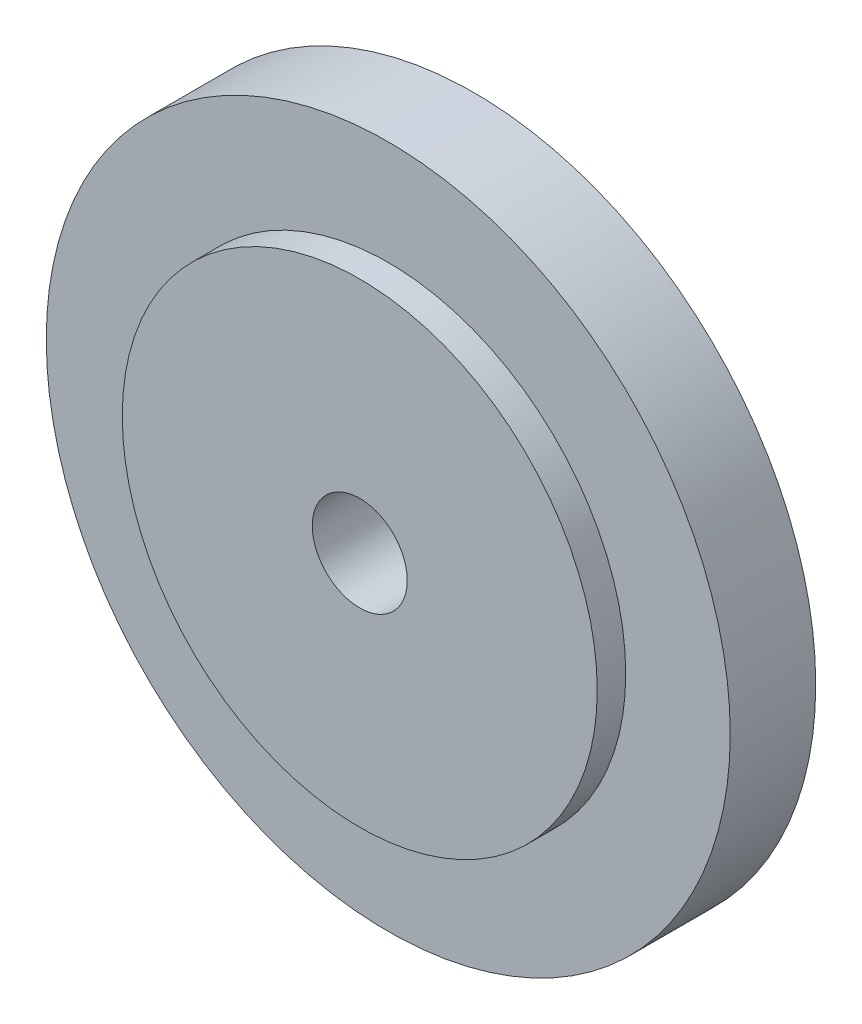
ISO-10303-21;
HEADER;
FILE_DESCRIPTION(('STEP AP214'),'2;1');
FILE_NAME('part.step','',(''),(''),'','','');
FILE_SCHEMA(('AUTOMOTIVE_DESIGN { 1 0 10303 214 1 1 1 1 }'));
ENDSEC;
DATA;
#1=APPLICATION_CONTEXT('core data for automotive mechanical design processes');
#2=APPLICATION_PROTOCOL_DEFINITION('international standard','automotive_design',2000,#1);
#3=PRODUCT_CONTEXT('',#1,'mechanical');
#4=PRODUCT('Part','Part','',(#3));
#5=PRODUCT_RELATED_PRODUCT_CATEGORY('part','',(#4));
#6=PRODUCT_DEFINITION_FORMATION('','',#4);
#7=PRODUCT_DEFINITION_CONTEXT('part definition',#1,'design');
#8=PRODUCT_DEFINITION('design','',#6,#7);
#9=PRODUCT_DEFINITION_SHAPE('','',#8);
#10=(LENGTH_UNIT() NAMED_UNIT(*) SI_UNIT(.MILLI.,.METRE.));
#11=(NAMED_UNIT(*) PLANE_ANGLE_UNIT() SI_UNIT($,.RADIAN.));
#12=(NAMED_UNIT(*) SI_UNIT($,.STERADIAN.) SOLID_ANGLE_UNIT());
#13=UNCERTAINTY_MEASURE_WITH_UNIT(LENGTH_MEASURE(1.E-05),#10,'distance_accuracy_value','');
#14=(GEOMETRIC_REPRESENTATION_CONTEXT(3) GLOBAL_UNCERTAINTY_ASSIGNED_CONTEXT((#13)) GLOBAL_UNIT_ASSIGNED_CONTEXT((#10,
#11,#12)) REPRESENTATION_CONTEXT('',''));
#15=CARTESIAN_POINT('',(0.,0.,0.));
#16=DIRECTION('',(0.,0.,1.));
#17=DIRECTION('',(1.,0.,0.));
#18=AXIS2_PLACEMENT_3D('',#15,#16,#17);
#19=CARTESIAN_POINT('',(0.,0.,4.5));
#20=DIRECTION('',(0.,0.,-1.));
#21=DIRECTION('',(-1.,0.,0.));
#22=AXIS2_PLACEMENT_3D('',#19,#20,#21);
#23=CYLINDRICAL_SURFACE('',#22,18.);
#24=CARTESIAN_POINT('',(0.,0.,4.5));
#25=DIRECTION('',(0.,0.,1.));
#26=DIRECTION('',(1.,0.,0.));
#27=AXIS2_PLACEMENT_3D('',#24,#25,#26);
#28=CIRCLE('',#27,18.);
#29=CARTESIAN_POINT('',(18.,0.,4.5));
#30=VERTEX_POINT('',#29);
#31=EDGE_CURVE('E44',#30,#30,#28,.T.);
#32=ORIENTED_EDGE('',*,*,#31,.F.);
#33=EDGE_LOOP('',(#32));
#34=FACE_BOUND('',#33,.T.);
#35=CARTESIAN_POINT('',(0.,0.,0.));
#36=DIRECTION('',(0.,0.,1.));
#37=DIRECTION('',(1.,0.,0.));
#38=AXIS2_PLACEMENT_3D('',#35,#36,#37);
#39=CIRCLE('',#38,18.);
#40=CARTESIAN_POINT('',(18.,0.,0.));
#41=VERTEX_POINT('',#40);
#42=EDGE_CURVE('E40',#41,#41,#39,.T.);
#43=ORIENTED_EDGE('',*,*,#42,.T.);
#44=EDGE_LOOP('',(#43));
#45=FACE_BOUND('',#44,.T.);
#46=ADVANCED_FACE('F37',(#34,#45),#23,.T.);
#47=CARTESIAN_POINT('',(0.,0.,4.5));
#48=DIRECTION('',(0.,0.,1.));
#49=DIRECTION('',(1.,0.,0.));
#50=AXIS2_PLACEMENT_3D('',#47,#48,#49);
#51=PLANE('',#50);
#52=CARTESIAN_POINT('',(0.,0.,4.5));
#53=DIRECTION('',(0.,0.,1.));
#54=DIRECTION('',(1.,0.,0.));
#55=AXIS2_PLACEMENT_3D('',#52,#53,#54);
#56=CIRCLE('',#55,12.5);
#57=CARTESIAN_POINT('',(12.5,0.,4.5));
#58=VERTEX_POINT('',#57);
#59=EDGE_CURVE('E10',#58,#58,#56,.T.);
#60=ORIENTED_EDGE('',*,*,#59,.F.);
#61=EDGE_LOOP('',(#60));
#62=FACE_BOUND('',#61,.T.);
#63=ORIENTED_EDGE('',*,*,#31,.T.);
#64=EDGE_LOOP('',(#63));
#65=FACE_BOUND('',#64,.T.);
#66=ADVANCED_FACE('F81',(#62,#65),#51,.T.);
#67=CARTESIAN_POINT('',(0.,0.,0.));
#68=DIRECTION('',(0.,0.,1.));
#69=DIRECTION('',(1.,0.,0.));
#70=AXIS2_PLACEMENT_3D('',#67,#68,#69);
#71=PLANE('',#70);
#72=CARTESIAN_POINT('',(0.,0.,0.));
#73=DIRECTION('',(0.,0.,1.));
#74=DIRECTION('',(1.,0.,0.));
#75=AXIS2_PLACEMENT_3D('',#72,#73,#74);
#76=CIRCLE('',#75,2.5);
#77=CARTESIAN_POINT('',(2.5,0.,0.));
#78=VERTEX_POINT('',#77);
#79=EDGE_CURVE('E53',#78,#78,#76,.T.);
#80=ORIENTED_EDGE('',*,*,#79,.T.);
#81=EDGE_LOOP('',(#80));
#82=FACE_BOUND('',#81,.T.);
#83=ORIENTED_EDGE('',*,*,#42,.F.);
#84=EDGE_LOOP('',(#83));
#85=FACE_BOUND('',#84,.T.);
#86=ADVANCED_FACE('F60',(#82,#85),#71,.F.);
#87=CARTESIAN_POINT('',(0.,0.,6.));
#88=DIRECTION('',(0.,0.,-1.));
#89=DIRECTION('',(-1.,0.,0.));
#90=AXIS2_PLACEMENT_3D('',#87,#88,#89);
#91=CYLINDRICAL_SURFACE('',#90,12.5);
#92=CARTESIAN_POINT('',(0.,0.,6.));
#93=DIRECTION('',(0.,0.,1.));
#94=DIRECTION('',(1.,0.,0.));
#95=AXIS2_PLACEMENT_3D('',#92,#93,#94);
#96=CIRCLE('',#95,12.5);
#97=CARTESIAN_POINT('',(12.5,0.,6.));
#98=VERTEX_POINT('',#97);
#99=EDGE_CURVE('E50',#98,#98,#96,.T.);
#100=ORIENTED_EDGE('',*,*,#99,.F.);
#101=EDGE_LOOP('',(#100));
#102=FACE_BOUND('',#101,.T.);
#103=ORIENTED_EDGE('',*,*,#59,.T.);
#104=EDGE_LOOP('',(#103));
#105=FACE_BOUND('',#104,.T.);
#106=ADVANCED_FACE('F72',(#102,#105),#91,.T.);
#107=CARTESIAN_POINT('',(0.,0.,6.));
#108=DIRECTION('',(0.,0.,1.));
#109=DIRECTION('',(1.,0.,0.));
#110=AXIS2_PLACEMENT_3D('',#107,#108,#109);
#111=PLANE('',#110);
#112=CARTESIAN_POINT('',(0.,0.,6.));
#113=DIRECTION('',(0.,0.,1.));
#114=DIRECTION('',(1.,0.,0.));
#115=AXIS2_PLACEMENT_3D('',#112,#113,#114);
#116=CIRCLE('',#115,2.5);
#117=CARTESIAN_POINT('',(2.5,0.,6.));
#118=VERTEX_POINT('',#117);
#119=EDGE_CURVE('E54',#118,#118,#116,.T.);
#120=ORIENTED_EDGE('',*,*,#119,.F.);
#121=EDGE_LOOP('',(#120));
#122=FACE_BOUND('',#121,.T.);
#123=ORIENTED_EDGE('',*,*,#99,.T.);
#124=EDGE_LOOP('',(#123));
#125=FACE_BOUND('',#124,.T.);
#126=ADVANCED_FACE('F66',(#122,#125),#111,.T.);
#127=CARTESIAN_POINT('',(0.,0.,0.));
#128=DIRECTION('',(0.,0.,1.));
#129=DIRECTION('',(1.,0.,0.));
#130=AXIS2_PLACEMENT_3D('',#127,#128,#129);
#131=CYLINDRICAL_SURFACE('',#130,2.5);
#132=ORIENTED_EDGE('',*,*,#79,.F.);
#133=EDGE_LOOP('',(#132));
#134=FACE_BOUND('',#133,.T.);
#135=ORIENTED_EDGE('',*,*,#119,.T.);
#136=EDGE_LOOP('',(#135));
#137=FACE_BOUND('',#136,.T.);
#138=ADVANCED_FACE('F63',(#134,#137),#131,.F.);
#139=CLOSED_SHELL('',(#46,#66,#86,#106,#126,#138));
#140=MANIFOLD_SOLID_BREP('B2',#139);
#141=ADVANCED_BREP_SHAPE_REPRESENTATION('',(#18,#140),#14);
#142=SHAPE_DEFINITION_REPRESENTATION(#9,#141);
ENDSEC;
END-ISO-10303-21;
